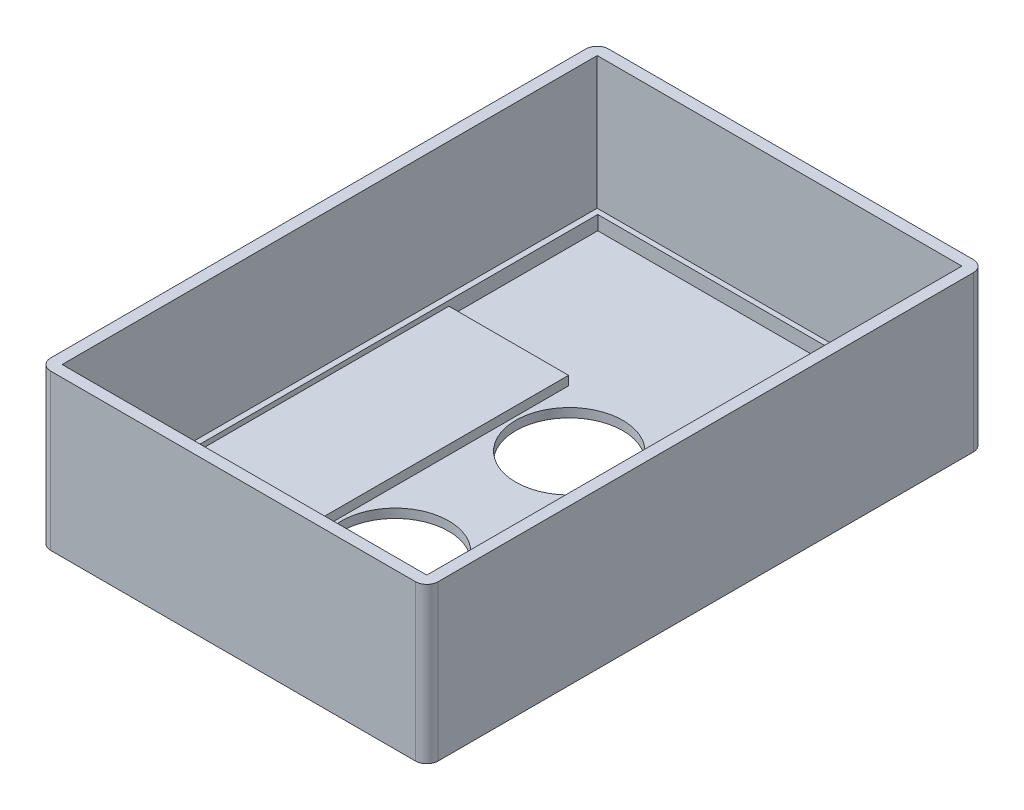
ISO-10303-21;
HEADER;
FILE_DESCRIPTION(('STEP AP214'),'2;1');
FILE_NAME('part.step','',(''),(''),'','','');
FILE_SCHEMA(('AUTOMOTIVE_DESIGN { 1 0 10303 214 1 1 1 1 }'));
ENDSEC;
DATA;
#1=APPLICATION_CONTEXT('core data for automotive mechanical design processes');
#2=APPLICATION_PROTOCOL_DEFINITION('international standard','automotive_design',2000,#1);
#3=PRODUCT_CONTEXT('',#1,'mechanical');
#4=PRODUCT('Part','Part','',(#3));
#5=PRODUCT_RELATED_PRODUCT_CATEGORY('part','',(#4));
#6=PRODUCT_DEFINITION_FORMATION('','',#4);
#7=PRODUCT_DEFINITION_CONTEXT('part definition',#1,'design');
#8=PRODUCT_DEFINITION('design','',#6,#7);
#9=PRODUCT_DEFINITION_SHAPE('','',#8);
#10=(LENGTH_UNIT() NAMED_UNIT(*) SI_UNIT(.MILLI.,.METRE.));
#11=(NAMED_UNIT(*) PLANE_ANGLE_UNIT() SI_UNIT($,.RADIAN.));
#12=(NAMED_UNIT(*) SI_UNIT($,.STERADIAN.) SOLID_ANGLE_UNIT());
#13=UNCERTAINTY_MEASURE_WITH_UNIT(LENGTH_MEASURE(1.E-05),#10,'distance_accuracy_value','');
#14=(GEOMETRIC_REPRESENTATION_CONTEXT(3) GLOBAL_UNCERTAINTY_ASSIGNED_CONTEXT((#13)) GLOBAL_UNIT_ASSIGNED_CONTEXT((#10,
#11,#12)) REPRESENTATION_CONTEXT('',''));
#15=CARTESIAN_POINT('',(0.,0.,0.));
#16=DIRECTION('',(0.,0.,1.));
#17=DIRECTION('',(1.,0.,0.));
#18=AXIS2_PLACEMENT_3D('',#15,#16,#17);
#19=CARTESIAN_POINT('',(0.,4.0386,0.));
#20=DIRECTION('',(0.,-1.,0.));
#21=DIRECTION('',(0.,0.,-1.));
#22=AXIS2_PLACEMENT_3D('',#19,#20,#21);
#23=PLANE('',#22);
#24=DIRECTION('',(1.,0.,0.));
#25=VECTOR('',#24,1.);
#26=CARTESIAN_POINT('',(30.48,4.0386,-87.471955448315));
#27=LINE('',#26,#25);
#28=CARTESIAN_POINT('',(3.81,4.0386,-87.471955448315));
#29=VERTEX_POINT('',#28);
#30=CARTESIAN_POINT('',(30.48,4.0386,-87.471955448315));
#31=VERTEX_POINT('',#30);
#32=EDGE_CURVE('E237',#29,#31,#27,.T.);
#33=ORIENTED_EDGE('',*,*,#32,.F.);
#34=DIRECTION('',(0.,0.,1.));
#35=VECTOR('',#34,1.);
#36=CARTESIAN_POINT('',(3.80999999999999,4.0386,-120.65));
#37=LINE('',#36,#35);
#38=CARTESIAN_POINT('',(3.81000000000001,4.0386,-3.81));
#39=VERTEX_POINT('',#38);
#40=EDGE_CURVE('E192',#29,#39,#37,.T.);
#41=ORIENTED_EDGE('',*,*,#40,.T.);
#42=DIRECTION('',(1.,0.,0.));
#43=VECTOR('',#42,1.);
#44=CARTESIAN_POINT('',(82.55,4.0386,-3.81000000000001));
#45=LINE('',#44,#43);
#46=CARTESIAN_POINT('',(30.48,4.0386,-3.81));
#47=VERTEX_POINT('',#46);
#48=EDGE_CURVE('E321',#39,#47,#45,.T.);
#49=ORIENTED_EDGE('',*,*,#48,.T.);
#50=DIRECTION('',(0.,0.,1.));
#51=VECTOR('',#50,1.);
#52=CARTESIAN_POINT('',(30.48,4.0386,-87.471955448315));
#53=LINE('',#52,#51);
#54=EDGE_CURVE('E240',#31,#47,#53,.T.);
#55=ORIENTED_EDGE('',*,*,#54,.F.);
#56=EDGE_LOOP('',(#33,#41,#49,#55));
#57=FACE_BOUND('',#56,.T.);
#58=ADVANCED_FACE('F34',(#57),#23,.F.);
#59=DIRECTION('',(0.,0.,-1.));
#60=VECTOR('',#59,1.);
#61=CARTESIAN_POINT('',(55.88,4.0386,-87.471955448315));
#62=LINE('',#61,#60);
#63=CARTESIAN_POINT('',(55.88,4.0386,-3.81));
#64=VERTEX_POINT('',#63);
#65=CARTESIAN_POINT('',(55.88,4.0386,-87.471955448315));
#66=VERTEX_POINT('',#65);
#67=EDGE_CURVE('E213',#64,#66,#62,.T.);
#68=ORIENTED_EDGE('',*,*,#67,.F.);
#69=CARTESIAN_POINT('',(82.55,4.0386,-3.81000000000001));
#70=VERTEX_POINT('',#69);
#71=EDGE_CURVE('E319',#64,#70,#45,.T.);
#72=ORIENTED_EDGE('',*,*,#71,.T.);
#73=DIRECTION('',(0.,0.,-1.));
#74=VECTOR('',#73,1.);
#75=CARTESIAN_POINT('',(82.55,4.0386,-120.65));
#76=LINE('',#75,#74);
#77=CARTESIAN_POINT('',(82.55,4.0386,-87.471955448315));
#78=VERTEX_POINT('',#77);
#79=EDGE_CURVE('E333',#70,#78,#76,.T.);
#80=ORIENTED_EDGE('',*,*,#79,.T.);
#81=DIRECTION('',(1.,0.,0.));
#82=VECTOR('',#81,1.);
#83=CARTESIAN_POINT('',(55.88,4.0386,-87.471955448315));
#84=LINE('',#83,#82);
#85=EDGE_CURVE('E210',#66,#78,#84,.T.);
#86=ORIENTED_EDGE('',*,*,#85,.F.);
#87=EDGE_LOOP('',(#68,#72,#80,#86));
#88=FACE_BOUND('',#87,.T.);
#89=ADVANCED_FACE('F436',(#88),#23,.F.);
#90=CARTESIAN_POINT('',(86.36,34.6202,-124.333));
#91=DIRECTION('',(-1.,0.,0.));
#92=DIRECTION('',(0.,0.,1.));
#93=AXIS2_PLACEMENT_3D('',#90,#91,#92);
#94=PLANE('',#93);
#95=DIRECTION('',(0.,0.,-1.));
#96=VECTOR('',#95,1.);
#97=CARTESIAN_POINT('',(86.36,34.6202,-124.333));
#98=LINE('',#97,#96);
#99=CARTESIAN_POINT('',(86.36,34.6202,-2.54));
#100=VERTEX_POINT('',#99);
#101=CARTESIAN_POINT('',(86.36,34.6202,-121.793));
#102=VERTEX_POINT('',#101);
#103=EDGE_CURVE('E313',#100,#102,#98,.T.);
#104=ORIENTED_EDGE('',*,*,#103,.F.);
#105=DIRECTION('',(0.,-1.,0.));
#106=VECTOR('',#105,1.);
#107=CARTESIAN_POINT('',(86.36,34.6202,-2.54));
#108=LINE('',#107,#106);
#109=CARTESIAN_POINT('',(86.36,0.,-2.54));
#110=VERTEX_POINT('',#109);
#111=EDGE_CURVE('E258',#100,#110,#108,.T.);
#112=ORIENTED_EDGE('',*,*,#111,.T.);
#113=DIRECTION('',(0.,0.,-1.));
#114=VECTOR('',#113,1.);
#115=CARTESIAN_POINT('',(86.36,0.,-124.333));
#116=LINE('',#115,#114);
#117=CARTESIAN_POINT('',(86.36,0.,-121.793));
#118=VERTEX_POINT('',#117);
#119=EDGE_CURVE('E303',#110,#118,#116,.T.);
#120=ORIENTED_EDGE('',*,*,#119,.T.);
#121=DIRECTION('',(0.,-1.,0.));
#122=VECTOR('',#121,1.);
#123=CARTESIAN_POINT('',(86.36,34.6202,-121.793));
#124=LINE('',#123,#122);
#125=EDGE_CURVE('E256',#118,#102,#124,.F.);
#126=ORIENTED_EDGE('',*,*,#125,.T.);
#127=EDGE_LOOP('',(#104,#112,#120,#126));
#128=FACE_BOUND('',#127,.T.);
#129=ADVANCED_FACE('F421',(#128),#94,.F.);
#130=CARTESIAN_POINT('',(86.36,34.6202,-124.333));
#131=DIRECTION('',(0.,0.,1.));
#132=DIRECTION('',(1.,0.,0.));
#133=AXIS2_PLACEMENT_3D('',#130,#131,#132);
#134=PLANE('',#133);
#135=DIRECTION('',(-1.,0.,0.));
#136=VECTOR('',#135,1.);
#137=CARTESIAN_POINT('',(86.36,0.,-124.333));
#138=LINE('',#137,#136);
#139=CARTESIAN_POINT('',(83.82,0.,-124.333));
#140=VERTEX_POINT('',#139);
#141=CARTESIAN_POINT('',(2.54,0.,-124.333));
#142=VERTEX_POINT('',#141);
#143=EDGE_CURVE('E292',#140,#142,#138,.T.);
#144=ORIENTED_EDGE('',*,*,#143,.T.);
#145=DIRECTION('',(0.,-1.,0.));
#146=VECTOR('',#145,1.);
#147=CARTESIAN_POINT('',(2.54,34.6202,-124.333));
#148=LINE('',#147,#146);
#149=CARTESIAN_POINT('',(2.54,34.6202,-124.333));
#150=VERTEX_POINT('',#149);
#151=EDGE_CURVE('E11',#142,#150,#148,.F.);
#152=ORIENTED_EDGE('',*,*,#151,.T.);
#153=DIRECTION('',(-1.,0.,0.));
#154=VECTOR('',#153,1.);
#155=CARTESIAN_POINT('',(86.36,34.6202,-124.333));
#156=LINE('',#155,#154);
#157=CARTESIAN_POINT('',(83.82,34.6202,-124.333));
#158=VERTEX_POINT('',#157);
#159=EDGE_CURVE('E294',#158,#150,#156,.T.);
#160=ORIENTED_EDGE('',*,*,#159,.F.);
#161=DIRECTION('',(0.,-1.,0.));
#162=VECTOR('',#161,1.);
#163=CARTESIAN_POINT('',(83.82,34.6202,-124.333));
#164=LINE('',#163,#162);
#165=EDGE_CURVE('E42',#158,#140,#164,.T.);
#166=ORIENTED_EDGE('',*,*,#165,.T.);
#167=EDGE_LOOP('',(#144,#152,#160,#166));
#168=FACE_BOUND('',#167,.T.);
#169=ADVANCED_FACE('F291',(#168),#134,.F.);
#170=CARTESIAN_POINT('',(0.,34.6202,-124.333));
#171=DIRECTION('',(1.,0.,0.));
#172=DIRECTION('',(0.,0.,-1.));
#173=AXIS2_PLACEMENT_3D('',#170,#171,#172);
#174=PLANE('',#173);
#175=DIRECTION('',(0.,0.,1.));
#176=VECTOR('',#175,1.);
#177=CARTESIAN_POINT('',(0.,0.,-124.333));
#178=LINE('',#177,#176);
#179=CARTESIAN_POINT('',(0.,0.,-121.793));
#180=VERTEX_POINT('',#179);
#181=CARTESIAN_POINT('',(0.,0.,-2.54000000000001));
#182=VERTEX_POINT('',#181);
#183=EDGE_CURVE('E302',#180,#182,#178,.T.);
#184=ORIENTED_EDGE('',*,*,#183,.T.);
#185=DIRECTION('',(0.,-1.,0.));
#186=VECTOR('',#185,1.);
#187=CARTESIAN_POINT('',(0.,34.6202,-2.53999999999999));
#188=LINE('',#187,#186);
#189=CARTESIAN_POINT('',(0.,34.6202,-2.54000000000001));
#190=VERTEX_POINT('',#189);
#191=EDGE_CURVE('E49',#182,#190,#188,.F.);
#192=ORIENTED_EDGE('',*,*,#191,.T.);
#193=DIRECTION('',(0.,0.,1.));
#194=VECTOR('',#193,1.);
#195=CARTESIAN_POINT('',(0.,34.6202,-124.333));
#196=LINE('',#195,#194);
#197=CARTESIAN_POINT('',(0.,34.6202,-121.793));
#198=VERTEX_POINT('',#197);
#199=EDGE_CURVE('E407',#198,#190,#196,.T.);
#200=ORIENTED_EDGE('',*,*,#199,.F.);
#201=DIRECTION('',(0.,-1.,0.));
#202=VECTOR('',#201,1.);
#203=CARTESIAN_POINT('',(0.,34.6202,-121.793));
#204=LINE('',#203,#202);
#205=EDGE_CURVE('E282',#198,#180,#204,.T.);
#206=ORIENTED_EDGE('',*,*,#205,.T.);
#207=EDGE_LOOP('',(#184,#192,#200,#206));
#208=FACE_BOUND('',#207,.T.);
#209=ADVANCED_FACE('F427',(#208),#174,.F.);
#210=CARTESIAN_POINT('',(86.36,34.6202,0.));
#211=DIRECTION('',(0.,0.,-1.));
#212=DIRECTION('',(-1.,0.,0.));
#213=AXIS2_PLACEMENT_3D('',#210,#211,#212);
#214=PLANE('',#213);
#215=DIRECTION('',(1.,0.,0.));
#216=VECTOR('',#215,1.);
#217=CARTESIAN_POINT('',(86.36,0.,0.));
#218=LINE('',#217,#216);
#219=CARTESIAN_POINT('',(2.54,0.,0.));
#220=VERTEX_POINT('',#219);
#221=CARTESIAN_POINT('',(83.82,0.,0.));
#222=VERTEX_POINT('',#221);
#223=EDGE_CURVE('E305',#220,#222,#218,.T.);
#224=ORIENTED_EDGE('',*,*,#223,.T.);
#225=DIRECTION('',(0.,-1.,0.));
#226=VECTOR('',#225,1.);
#227=CARTESIAN_POINT('',(83.82,34.6202,0.));
#228=LINE('',#227,#226);
#229=CARTESIAN_POINT('',(83.82,34.6202,0.));
#230=VERTEX_POINT('',#229);
#231=EDGE_CURVE('E273',#222,#230,#228,.F.);
#232=ORIENTED_EDGE('',*,*,#231,.T.);
#233=DIRECTION('',(1.,0.,0.));
#234=VECTOR('',#233,1.);
#235=CARTESIAN_POINT('',(86.36,34.6202,0.));
#236=LINE('',#235,#234);
#237=CARTESIAN_POINT('',(2.54,34.6202,0.));
#238=VERTEX_POINT('',#237);
#239=EDGE_CURVE('E316',#238,#230,#236,.T.);
#240=ORIENTED_EDGE('',*,*,#239,.F.);
#241=DIRECTION('',(0.,-1.,0.));
#242=VECTOR('',#241,1.);
#243=CARTESIAN_POINT('',(2.54,34.6202,0.));
#244=LINE('',#243,#242);
#245=EDGE_CURVE('E270',#238,#220,#244,.T.);
#246=ORIENTED_EDGE('',*,*,#245,.T.);
#247=EDGE_LOOP('',(#224,#232,#240,#246));
#248=FACE_BOUND('',#247,.T.);
#249=ADVANCED_FACE('F424',(#248),#214,.F.);
#250=CARTESIAN_POINT('',(0.,34.6202,0.));
#251=DIRECTION('',(0.,-1.,0.));
#252=DIRECTION('',(0.,0.,-1.));
#253=AXIS2_PLACEMENT_3D('',#250,#251,#252);
#254=PLANE('',#253);
#255=DIRECTION('',(1.,0.,0.));
#256=VECTOR('',#255,1.);
#257=CARTESIAN_POINT('',(83.82,34.6202,-2.54));
#258=LINE('',#257,#256);
#259=CARTESIAN_POINT('',(2.54,34.6202,-2.53999999999999));
#260=VERTEX_POINT('',#259);
#261=CARTESIAN_POINT('',(83.82,34.6202,-2.54));
#262=VERTEX_POINT('',#261);
#263=EDGE_CURVE('E346',#260,#262,#258,.T.);
#264=ORIENTED_EDGE('',*,*,#263,.F.);
#265=DIRECTION('',(0.,0.,1.));
#266=VECTOR('',#265,1.);
#267=CARTESIAN_POINT('',(2.53999999999999,34.6202,-121.793));
#268=LINE('',#267,#266);
#269=CARTESIAN_POINT('',(2.53999999999999,34.6202,-121.793));
#270=VERTEX_POINT('',#269);
#271=EDGE_CURVE('E339',#270,#260,#268,.T.);
#272=ORIENTED_EDGE('',*,*,#271,.F.);
#273=DIRECTION('',(-1.,0.,0.));
#274=VECTOR('',#273,1.);
#275=CARTESIAN_POINT('',(83.82,34.6202,-121.793));
#276=LINE('',#275,#274);
#277=CARTESIAN_POINT('',(83.82,34.6202,-121.793));
#278=VERTEX_POINT('',#277);
#279=EDGE_CURVE('E358',#278,#270,#276,.T.);
#280=ORIENTED_EDGE('',*,*,#279,.F.);
#281=DIRECTION('',(0.,0.,-1.));
#282=VECTOR('',#281,1.);
#283=CARTESIAN_POINT('',(83.82,34.6202,-121.793));
#284=LINE('',#283,#282);
#285=EDGE_CURVE('E370',#262,#278,#284,.T.);
#286=ORIENTED_EDGE('',*,*,#285,.F.);
#287=EDGE_LOOP('',(#264,#272,#280,#286));
#288=FACE_BOUND('',#287,.T.);
#289=ORIENTED_EDGE('',*,*,#239,.T.);
#290=CARTESIAN_POINT('',(83.82,34.6202,-2.54));
#291=DIRECTION('',(0.,-1.,0.));
#292=DIRECTION('',(0.,0.,-1.));
#293=AXIS2_PLACEMENT_3D('',#290,#291,#292);
#294=CIRCLE('',#293,2.54);
#295=EDGE_CURVE('E280',#230,#100,#294,.F.);
#296=ORIENTED_EDGE('',*,*,#295,.T.);
#297=ORIENTED_EDGE('',*,*,#103,.T.);
#298=CARTESIAN_POINT('',(83.82,34.6202,-121.793));
#299=DIRECTION('',(0.,-1.,0.));
#300=DIRECTION('',(0.,0.,-1.));
#301=AXIS2_PLACEMENT_3D('',#298,#299,#300);
#302=CIRCLE('',#301,2.54);
#303=EDGE_CURVE('E275',#102,#158,#302,.F.);
#304=ORIENTED_EDGE('',*,*,#303,.T.);
#305=ORIENTED_EDGE('',*,*,#159,.T.);
#306=CARTESIAN_POINT('',(2.54,34.6202,-121.793));
#307=DIRECTION('',(0.,-1.,0.));
#308=DIRECTION('',(0.,0.,-1.));
#309=AXIS2_PLACEMENT_3D('',#306,#307,#308);
#310=CIRCLE('',#309,2.54);
#311=EDGE_CURVE('E56',#150,#198,#310,.F.);
#312=ORIENTED_EDGE('',*,*,#311,.T.);
#313=ORIENTED_EDGE('',*,*,#199,.T.);
#314=CARTESIAN_POINT('',(2.54,34.6202,-2.53999999999999));
#315=DIRECTION('',(0.,-1.,0.));
#316=DIRECTION('',(0.,0.,-1.));
#317=AXIS2_PLACEMENT_3D('',#314,#315,#316);
#318=CIRCLE('',#317,2.54);
#319=EDGE_CURVE('E278',#190,#238,#318,.F.);
#320=ORIENTED_EDGE('',*,*,#319,.T.);
#321=EDGE_LOOP('',(#289,#296,#297,#304,#305,#312,#313,#320));
#322=FACE_BOUND('',#321,.T.);
#323=ADVANCED_FACE('F411',(#288,#322),#254,.F.);
#324=CARTESIAN_POINT('',(0.,0.,0.));
#325=DIRECTION('',(0.,-1.,0.));
#326=DIRECTION('',(0.,0.,-1.));
#327=AXIS2_PLACEMENT_3D('',#324,#325,#326);
#328=PLANE('',#327);
#329=CARTESIAN_POINT('',(43.18,0.,-74.93));
#330=DIRECTION('',(0.,-1.,0.));
#331=DIRECTION('',(0.,0.,-1.));
#332=AXIS2_PLACEMENT_3D('',#329,#330,#331);
#333=CIRCLE('',#332,11.938);
#334=CARTESIAN_POINT('',(43.18,0.,-86.868));
#335=VERTEX_POINT('',#334);
#336=EDGE_CURVE('E712',#335,#335,#333,.T.);
#337=ORIENTED_EDGE('',*,*,#336,.F.);
#338=EDGE_LOOP('',(#337));
#339=FACE_BOUND('',#338,.T.);
#340=CARTESIAN_POINT('',(43.18,0.,-36.1188));
#341=DIRECTION('',(0.,-1.,0.));
#342=DIRECTION('',(0.,0.,-1.));
#343=AXIS2_PLACEMENT_3D('',#340,#341,#342);
#344=CIRCLE('',#343,11.938);
#345=CARTESIAN_POINT('',(43.18,0.,-48.0568));
#346=VERTEX_POINT('',#345);
#347=EDGE_CURVE('E216',#346,#346,#344,.T.);
#348=ORIENTED_EDGE('',*,*,#347,.F.);
#349=EDGE_LOOP('',(#348));
#350=FACE_BOUND('',#349,.T.);
#351=ORIENTED_EDGE('',*,*,#119,.F.);
#352=CARTESIAN_POINT('',(83.82,0.,-2.54));
#353=DIRECTION('',(0.,-1.,0.));
#354=DIRECTION('',(0.,0.,-1.));
#355=AXIS2_PLACEMENT_3D('',#352,#353,#354);
#356=CIRCLE('',#355,2.54);
#357=EDGE_CURVE('E268',#110,#222,#356,.T.);
#358=ORIENTED_EDGE('',*,*,#357,.T.);
#359=ORIENTED_EDGE('',*,*,#223,.F.);
#360=CARTESIAN_POINT('',(2.54,0.,-2.53999999999999));
#361=DIRECTION('',(0.,-1.,0.));
#362=DIRECTION('',(0.,0.,-1.));
#363=AXIS2_PLACEMENT_3D('',#360,#361,#362);
#364=CIRCLE('',#363,2.54);
#365=EDGE_CURVE('E266',#220,#182,#364,.T.);
#366=ORIENTED_EDGE('',*,*,#365,.T.);
#367=ORIENTED_EDGE('',*,*,#183,.F.);
#368=CARTESIAN_POINT('',(2.54,0.,-121.793));
#369=DIRECTION('',(0.,-1.,0.));
#370=DIRECTION('',(0.,0.,-1.));
#371=AXIS2_PLACEMENT_3D('',#368,#369,#370);
#372=CIRCLE('',#371,2.54);
#373=EDGE_CURVE('E264',#180,#142,#372,.T.);
#374=ORIENTED_EDGE('',*,*,#373,.T.);
#375=ORIENTED_EDGE('',*,*,#143,.F.);
#376=CARTESIAN_POINT('',(83.82,0.,-121.793));
#377=DIRECTION('',(0.,-1.,0.));
#378=DIRECTION('',(0.,0.,-1.));
#379=AXIS2_PLACEMENT_3D('',#376,#377,#378);
#380=CIRCLE('',#379,2.54);
#381=EDGE_CURVE('E262',#140,#118,#380,.T.);
#382=ORIENTED_EDGE('',*,*,#381,.T.);
#383=EDGE_LOOP('',(#351,#358,#359,#366,#367,#374,#375,#382));
#384=FACE_BOUND('',#383,.T.);
#385=ADVANCED_FACE('F299',(#339,#350,#384),#328,.T.);
#386=CARTESIAN_POINT('',(0.,5.1562,0.));
#387=DIRECTION('',(0.,-1.,0.));
#388=DIRECTION('',(0.,0.,-1.));
#389=AXIS2_PLACEMENT_3D('',#386,#387,#388);
#390=PLANE('',#389);
#391=DIRECTION('',(0.,0.,1.));
#392=VECTOR('',#391,1.);
#393=CARTESIAN_POINT('',(2.53999999999999,5.1562,-121.793));
#394=LINE('',#393,#392);
#395=CARTESIAN_POINT('',(2.53999999999999,5.1562,-121.793));
#396=VERTEX_POINT('',#395);
#397=CARTESIAN_POINT('',(2.54,5.1562,-2.53999999999999));
#398=VERTEX_POINT('',#397);
#399=EDGE_CURVE('E354',#396,#398,#394,.T.);
#400=ORIENTED_EDGE('',*,*,#399,.T.);
#401=DIRECTION('',(1.,0.,0.));
#402=VECTOR('',#401,1.);
#403=CARTESIAN_POINT('',(83.82,5.1562,-2.54));
#404=LINE('',#403,#402);
#405=CARTESIAN_POINT('',(83.82,5.1562,-2.54));
#406=VERTEX_POINT('',#405);
#407=EDGE_CURVE('E357',#398,#406,#404,.T.);
#408=ORIENTED_EDGE('',*,*,#407,.T.);
#409=DIRECTION('',(0.,0.,-1.));
#410=VECTOR('',#409,1.);
#411=CARTESIAN_POINT('',(83.82,5.1562,-121.793));
#412=LINE('',#411,#410);
#413=CARTESIAN_POINT('',(83.82,5.1562,-121.793));
#414=VERTEX_POINT('',#413);
#415=EDGE_CURVE('E361',#406,#414,#412,.T.);
#416=ORIENTED_EDGE('',*,*,#415,.T.);
#417=DIRECTION('',(-1.,0.,0.));
#418=VECTOR('',#417,1.);
#419=CARTESIAN_POINT('',(83.82,5.1562,-121.793));
#420=LINE('',#419,#418);
#421=EDGE_CURVE('E364',#414,#396,#420,.T.);
#422=ORIENTED_EDGE('',*,*,#421,.T.);
#423=EDGE_LOOP('',(#400,#408,#416,#422));
#424=FACE_BOUND('',#423,.T.);
#425=DIRECTION('',(-1.,0.,0.));
#426=VECTOR('',#425,1.);
#427=CARTESIAN_POINT('',(82.55,5.1562,-120.65));
#428=LINE('',#427,#426);
#429=CARTESIAN_POINT('',(82.55,5.1562,-120.65));
#430=VERTEX_POINT('',#429);
#431=CARTESIAN_POINT('',(3.80999999999999,5.1562,-120.65));
#432=VERTEX_POINT('',#431);
#433=EDGE_CURVE('E385',#430,#432,#428,.T.);
#434=ORIENTED_EDGE('',*,*,#433,.F.);
#435=DIRECTION('',(0.,0.,-1.));
#436=VECTOR('',#435,1.);
#437=CARTESIAN_POINT('',(82.55,5.1562,-120.65));
#438=LINE('',#437,#436);
#439=CARTESIAN_POINT('',(82.55,5.1562,-3.81000000000001));
#440=VERTEX_POINT('',#439);
#441=EDGE_CURVE('E377',#440,#430,#438,.T.);
#442=ORIENTED_EDGE('',*,*,#441,.F.);
#443=DIRECTION('',(1.,0.,0.));
#444=VECTOR('',#443,1.);
#445=CARTESIAN_POINT('',(82.55,5.1562,-3.81000000000001));
#446=LINE('',#445,#444);
#447=CARTESIAN_POINT('',(3.81000000000001,5.1562,-3.81));
#448=VERTEX_POINT('',#447);
#449=EDGE_CURVE('E259',#448,#440,#446,.T.);
#450=ORIENTED_EDGE('',*,*,#449,.F.);
#451=DIRECTION('',(0.,0.,1.));
#452=VECTOR('',#451,1.);
#453=CARTESIAN_POINT('',(3.80999999999999,5.1562,-120.65));
#454=LINE('',#453,#452);
#455=EDGE_CURVE('E320',#432,#448,#454,.T.);
#456=ORIENTED_EDGE('',*,*,#455,.F.);
#457=EDGE_LOOP('',(#434,#442,#450,#456));
#458=FACE_BOUND('',#457,.T.);
#459=ADVANCED_FACE('F464',(#424,#458),#390,.F.);
#460=CARTESIAN_POINT('',(2.53999999999999,5.1562,-121.793));
#461=DIRECTION('',(-1.,0.,0.));
#462=DIRECTION('',(0.,0.,1.));
#463=AXIS2_PLACEMENT_3D('',#460,#461,#462);
#464=PLANE('',#463);
#465=ORIENTED_EDGE('',*,*,#271,.T.);
#466=DIRECTION('',(0.,1.,0.));
#467=VECTOR('',#466,1.);
#468=CARTESIAN_POINT('',(2.54,5.1562,-2.53999999999999));
#469=LINE('',#468,#467);
#470=EDGE_CURVE('E366',#398,#260,#469,.T.);
#471=ORIENTED_EDGE('',*,*,#470,.F.);
#472=ORIENTED_EDGE('',*,*,#399,.F.);
#473=DIRECTION('',(0.,1.,0.));
#474=VECTOR('',#473,1.);
#475=CARTESIAN_POINT('',(2.53999999999999,5.1562,-121.793));
#476=LINE('',#475,#474);
#477=EDGE_CURVE('E375',#396,#270,#476,.T.);
#478=ORIENTED_EDGE('',*,*,#477,.T.);
#479=EDGE_LOOP('',(#465,#471,#472,#478));
#480=FACE_BOUND('',#479,.T.);
#481=ADVANCED_FACE('F445',(#480),#464,.F.);
#482=CARTESIAN_POINT('',(83.82,5.1562,-121.793));
#483=DIRECTION('',(0.,0.,-1.));
#484=DIRECTION('',(-1.,0.,0.));
#485=AXIS2_PLACEMENT_3D('',#482,#483,#484);
#486=PLANE('',#485);
#487=ORIENTED_EDGE('',*,*,#279,.T.);
#488=ORIENTED_EDGE('',*,*,#477,.F.);
#489=ORIENTED_EDGE('',*,*,#421,.F.);
#490=DIRECTION('',(0.,1.,0.));
#491=VECTOR('',#490,1.);
#492=CARTESIAN_POINT('',(83.82,5.1562,-121.793));
#493=LINE('',#492,#491);
#494=EDGE_CURVE('E378',#414,#278,#493,.T.);
#495=ORIENTED_EDGE('',*,*,#494,.T.);
#496=EDGE_LOOP('',(#487,#488,#489,#495));
#497=FACE_BOUND('',#496,.T.);
#498=ADVANCED_FACE('F616',(#497),#486,.F.);
#499=CARTESIAN_POINT('',(83.82,5.1562,-121.793));
#500=DIRECTION('',(1.,0.,0.));
#501=DIRECTION('',(0.,0.,-1.));
#502=AXIS2_PLACEMENT_3D('',#499,#500,#501);
#503=PLANE('',#502);
#504=ORIENTED_EDGE('',*,*,#285,.T.);
#505=ORIENTED_EDGE('',*,*,#494,.F.);
#506=ORIENTED_EDGE('',*,*,#415,.F.);
#507=DIRECTION('',(0.,1.,0.));
#508=VECTOR('',#507,1.);
#509=CARTESIAN_POINT('',(83.82,5.1562,-2.54));
#510=LINE('',#509,#508);
#511=EDGE_CURVE('E380',#406,#262,#510,.T.);
#512=ORIENTED_EDGE('',*,*,#511,.T.);
#513=EDGE_LOOP('',(#504,#505,#506,#512));
#514=FACE_BOUND('',#513,.T.);
#515=ADVANCED_FACE('F608',(#514),#503,.F.);
#516=CARTESIAN_POINT('',(83.82,5.1562,-2.54));
#517=DIRECTION('',(0.,0.,1.));
#518=DIRECTION('',(1.,0.,0.));
#519=AXIS2_PLACEMENT_3D('',#516,#517,#518);
#520=PLANE('',#519);
#521=ORIENTED_EDGE('',*,*,#263,.T.);
#522=ORIENTED_EDGE('',*,*,#511,.F.);
#523=ORIENTED_EDGE('',*,*,#407,.F.);
#524=ORIENTED_EDGE('',*,*,#470,.T.);
#525=EDGE_LOOP('',(#521,#522,#523,#524));
#526=FACE_BOUND('',#525,.T.);
#527=ADVANCED_FACE('F455',(#526),#520,.F.);
#528=CARTESIAN_POINT('',(82.55,4.0386,-3.81000000000001));
#529=DIRECTION('',(0.,0.,1.));
#530=DIRECTION('',(1.,0.,0.));
#531=AXIS2_PLACEMENT_3D('',#528,#529,#530);
#532=PLANE('',#531);
#533=DIRECTION('',(0.,1.,0.));
#534=VECTOR('',#533,1.);
#535=CARTESIAN_POINT('',(3.81000000000001,4.0386,-3.81));
#536=LINE('',#535,#534);
#537=EDGE_CURVE('E336',#39,#448,#536,.T.);
#538=ORIENTED_EDGE('',*,*,#537,.T.);
#539=ORIENTED_EDGE('',*,*,#449,.T.);
#540=DIRECTION('',(0.,1.,0.));
#541=VECTOR('',#540,1.);
#542=CARTESIAN_POINT('',(82.55,4.0386,-3.81000000000001));
#543=LINE('',#542,#541);
#544=EDGE_CURVE('E398',#70,#440,#543,.T.);
#545=ORIENTED_EDGE('',*,*,#544,.F.);
#546=ORIENTED_EDGE('',*,*,#71,.F.);
#547=DIRECTION('',(0.,1.,0.));
#548=VECTOR('',#547,1.);
#549=CARTESIAN_POINT('',(55.88,2.0066,-3.81));
#550=LINE('',#549,#548);
#551=CARTESIAN_POINT('',(55.88,2.0066,-3.81));
#552=VERTEX_POINT('',#551);
#553=EDGE_CURVE('E244',#552,#64,#550,.T.);
#554=ORIENTED_EDGE('',*,*,#553,.F.);
#555=DIRECTION('',(1.,0.,0.));
#556=VECTOR('',#555,1.);
#557=CARTESIAN_POINT('',(30.48,2.0066,-3.81));
#558=LINE('',#557,#556);
#559=CARTESIAN_POINT('',(30.48,2.0066,-3.81));
#560=VERTEX_POINT('',#559);
#561=EDGE_CURVE('E220',#560,#552,#558,.T.);
#562=ORIENTED_EDGE('',*,*,#561,.F.);
#563=DIRECTION('',(0.,1.,0.));
#564=VECTOR('',#563,1.);
#565=CARTESIAN_POINT('',(30.48,2.0066,-3.81));
#566=LINE('',#565,#564);
#567=EDGE_CURVE('E242',#560,#47,#566,.T.);
#568=ORIENTED_EDGE('',*,*,#567,.T.);
#569=ORIENTED_EDGE('',*,*,#48,.F.);
#570=EDGE_LOOP('',(#538,#539,#545,#546,#554,#562,#568,#569));
#571=FACE_BOUND('',#570,.T.);
#572=ADVANCED_FACE('F394',(#571),#532,.F.);
#573=CARTESIAN_POINT('',(82.55,4.0386,-120.65));
#574=DIRECTION('',(1.,0.,0.));
#575=DIRECTION('',(0.,0.,-1.));
#576=AXIS2_PLACEMENT_3D('',#573,#574,#575);
#577=PLANE('',#576);
#578=ORIENTED_EDGE('',*,*,#544,.T.);
#579=ORIENTED_EDGE('',*,*,#441,.T.);
#580=DIRECTION('',(0.,1.,0.));
#581=VECTOR('',#580,1.);
#582=CARTESIAN_POINT('',(82.55,4.0386,-120.65));
#583=LINE('',#582,#581);
#584=CARTESIAN_POINT('',(82.55,2.0066,-120.65));
#585=VERTEX_POINT('',#584);
#586=EDGE_CURVE('E400',#585,#430,#583,.T.);
#587=ORIENTED_EDGE('',*,*,#586,.F.);
#588=DIRECTION('',(0.,0.,-1.));
#589=VECTOR('',#588,1.);
#590=CARTESIAN_POINT('',(82.55,2.0066,-120.65));
#591=LINE('',#590,#589);
#592=CARTESIAN_POINT('',(82.55,2.0066,-87.471955448315));
#593=VERTEX_POINT('',#592);
#594=EDGE_CURVE('E229',#593,#585,#591,.T.);
#595=ORIENTED_EDGE('',*,*,#594,.F.);
#596=DIRECTION('',(0.,1.,0.));
#597=VECTOR('',#596,1.);
#598=CARTESIAN_POINT('',(82.55,2.0066,-87.471955448315));
#599=LINE('',#598,#597);
#600=EDGE_CURVE('E337',#593,#78,#599,.T.);
#601=ORIENTED_EDGE('',*,*,#600,.T.);
#602=ORIENTED_EDGE('',*,*,#79,.F.);
#603=EDGE_LOOP('',(#578,#579,#587,#595,#601,#602));
#604=FACE_BOUND('',#603,.T.);
#605=ADVANCED_FACE('F450',(#604),#577,.F.);
#606=CARTESIAN_POINT('',(82.55,4.0386,-120.65));
#607=DIRECTION('',(0.,0.,-1.));
#608=DIRECTION('',(-1.,0.,0.));
#609=AXIS2_PLACEMENT_3D('',#606,#607,#608);
#610=PLANE('',#609);
#611=ORIENTED_EDGE('',*,*,#586,.T.);
#612=ORIENTED_EDGE('',*,*,#433,.T.);
#613=DIRECTION('',(0.,1.,0.));
#614=VECTOR('',#613,1.);
#615=CARTESIAN_POINT('',(3.80999999999999,4.0386,-120.65));
#616=LINE('',#615,#614);
#617=CARTESIAN_POINT('',(3.80999999999999,2.0066,-120.65));
#618=VERTEX_POINT('',#617);
#619=EDGE_CURVE('E307',#618,#432,#616,.T.);
#620=ORIENTED_EDGE('',*,*,#619,.F.);
#621=DIRECTION('',(-1.,0.,0.));
#622=VECTOR('',#621,1.);
#623=CARTESIAN_POINT('',(3.80999999999999,2.0066,-120.65));
#624=LINE('',#623,#622);
#625=EDGE_CURVE('E197',#585,#618,#624,.T.);
#626=ORIENTED_EDGE('',*,*,#625,.F.);
#627=EDGE_LOOP('',(#611,#612,#620,#626));
#628=FACE_BOUND('',#627,.T.);
#629=ADVANCED_FACE('F447',(#628),#610,.F.);
#630=CARTESIAN_POINT('',(3.80999999999999,4.0386,-120.65));
#631=DIRECTION('',(-1.,0.,0.));
#632=DIRECTION('',(0.,0.,1.));
#633=AXIS2_PLACEMENT_3D('',#630,#631,#632);
#634=PLANE('',#633);
#635=ORIENTED_EDGE('',*,*,#619,.T.);
#636=ORIENTED_EDGE('',*,*,#455,.T.);
#637=ORIENTED_EDGE('',*,*,#537,.F.);
#638=ORIENTED_EDGE('',*,*,#40,.F.);
#639=DIRECTION('',(0.,1.,0.));
#640=VECTOR('',#639,1.);
#641=CARTESIAN_POINT('',(3.81,2.0066,-87.471955448315));
#642=LINE('',#641,#640);
#643=CARTESIAN_POINT('',(3.81,2.0066,-87.471955448315));
#644=VERTEX_POINT('',#643);
#645=EDGE_CURVE('E184',#644,#29,#642,.T.);
#646=ORIENTED_EDGE('',*,*,#645,.F.);
#647=DIRECTION('',(0.,0.,1.));
#648=VECTOR('',#647,1.);
#649=CARTESIAN_POINT('',(3.80999999999999,2.0066,-120.65));
#650=LINE('',#649,#648);
#651=EDGE_CURVE('E189',#618,#644,#650,.T.);
#652=ORIENTED_EDGE('',*,*,#651,.F.);
#653=EDGE_LOOP('',(#635,#636,#637,#638,#646,#652));
#654=FACE_BOUND('',#653,.T.);
#655=ADVANCED_FACE('F187',(#654),#634,.F.);
#656=CARTESIAN_POINT('',(55.88,2.0066,-87.471955448315));
#657=DIRECTION('',(0.,0.,1.));
#658=DIRECTION('',(1.,0.,0.));
#659=AXIS2_PLACEMENT_3D('',#656,#657,#658);
#660=PLANE('',#659);
#661=ORIENTED_EDGE('',*,*,#85,.T.);
#662=ORIENTED_EDGE('',*,*,#600,.F.);
#663=DIRECTION('',(1.,0.,0.));
#664=VECTOR('',#663,1.);
#665=CARTESIAN_POINT('',(55.88,2.0066,-87.471955448315));
#666=LINE('',#665,#664);
#667=CARTESIAN_POINT('',(55.88,2.0066,-87.471955448315));
#668=VERTEX_POINT('',#667);
#669=EDGE_CURVE('E226',#668,#593,#666,.T.);
#670=ORIENTED_EDGE('',*,*,#669,.F.);
#671=DIRECTION('',(0.,1.,0.));
#672=VECTOR('',#671,1.);
#673=CARTESIAN_POINT('',(55.88,2.0066,-87.471955448315));
#674=LINE('',#673,#672);
#675=EDGE_CURVE('E252',#668,#66,#674,.T.);
#676=ORIENTED_EDGE('',*,*,#675,.T.);
#677=EDGE_LOOP('',(#661,#662,#670,#676));
#678=FACE_BOUND('',#677,.T.);
#679=ADVANCED_FACE('F458',(#678),#660,.F.);
#680=CARTESIAN_POINT('',(55.88,2.0066,-87.471955448315));
#681=DIRECTION('',(1.,0.,0.));
#682=DIRECTION('',(0.,0.,-1.));
#683=AXIS2_PLACEMENT_3D('',#680,#681,#682);
#684=PLANE('',#683);
#685=ORIENTED_EDGE('',*,*,#67,.T.);
#686=ORIENTED_EDGE('',*,*,#675,.F.);
#687=DIRECTION('',(0.,0.,-1.));
#688=VECTOR('',#687,1.);
#689=CARTESIAN_POINT('',(55.88,2.0066,-87.471955448315));
#690=LINE('',#689,#688);
#691=EDGE_CURVE('E223',#552,#668,#690,.T.);
#692=ORIENTED_EDGE('',*,*,#691,.F.);
#693=ORIENTED_EDGE('',*,*,#553,.T.);
#694=EDGE_LOOP('',(#685,#686,#692,#693));
#695=FACE_BOUND('',#694,.T.);
#696=ADVANCED_FACE('F541',(#695),#684,.F.);
#697=CARTESIAN_POINT('',(30.48,2.0066,-87.471955448315));
#698=DIRECTION('',(-1.,0.,0.));
#699=DIRECTION('',(0.,0.,1.));
#700=AXIS2_PLACEMENT_3D('',#697,#698,#699);
#701=PLANE('',#700);
#702=ORIENTED_EDGE('',*,*,#54,.T.);
#703=ORIENTED_EDGE('',*,*,#567,.F.);
#704=DIRECTION('',(0.,0.,1.));
#705=VECTOR('',#704,1.);
#706=CARTESIAN_POINT('',(30.48,2.0066,-87.471955448315));
#707=LINE('',#706,#705);
#708=CARTESIAN_POINT('',(30.48,2.0066,-87.471955448315));
#709=VERTEX_POINT('',#708);
#710=EDGE_CURVE('E205',#709,#560,#707,.T.);
#711=ORIENTED_EDGE('',*,*,#710,.F.);
#712=DIRECTION('',(0.,1.,0.));
#713=VECTOR('',#712,1.);
#714=CARTESIAN_POINT('',(30.48,2.0066,-87.471955448315));
#715=LINE('',#714,#713);
#716=EDGE_CURVE('E196',#709,#31,#715,.T.);
#717=ORIENTED_EDGE('',*,*,#716,.T.);
#718=EDGE_LOOP('',(#702,#703,#711,#717));
#719=FACE_BOUND('',#718,.T.);
#720=ADVANCED_FACE('F533',(#719),#701,.F.);
#721=CARTESIAN_POINT('',(30.48,2.0066,-87.471955448315));
#722=DIRECTION('',(0.,0.,1.));
#723=DIRECTION('',(1.,0.,0.));
#724=AXIS2_PLACEMENT_3D('',#721,#722,#723);
#725=PLANE('',#724);
#726=ORIENTED_EDGE('',*,*,#32,.T.);
#727=ORIENTED_EDGE('',*,*,#716,.F.);
#728=DIRECTION('',(1.,0.,0.));
#729=VECTOR('',#728,1.);
#730=CARTESIAN_POINT('',(30.48,2.0066,-87.471955448315));
#731=LINE('',#730,#729);
#732=EDGE_CURVE('E200',#644,#709,#731,.T.);
#733=ORIENTED_EDGE('',*,*,#732,.F.);
#734=ORIENTED_EDGE('',*,*,#645,.T.);
#735=EDGE_LOOP('',(#726,#727,#733,#734));
#736=FACE_BOUND('',#735,.T.);
#737=ADVANCED_FACE('F201',(#736),#725,.F.);
#738=CARTESIAN_POINT('',(0.,2.0066,0.));
#739=DIRECTION('',(0.,-1.,0.));
#740=DIRECTION('',(0.,0.,-1.));
#741=AXIS2_PLACEMENT_3D('',#738,#739,#740);
#742=PLANE('',#741);
#743=CARTESIAN_POINT('',(43.18,2.0066,-74.93));
#744=DIRECTION('',(0.,1.,0.));
#745=DIRECTION('',(0.,0.,1.));
#746=AXIS2_PLACEMENT_3D('',#743,#744,#745);
#747=CIRCLE('',#746,11.938);
#748=CARTESIAN_POINT('',(43.18,2.0066,-62.992));
#749=VERTEX_POINT('',#748);
#750=EDGE_CURVE('E707',#749,#749,#747,.T.);
#751=ORIENTED_EDGE('',*,*,#750,.F.);
#752=EDGE_LOOP('',(#751));
#753=FACE_BOUND('',#752,.T.);
#754=CARTESIAN_POINT('',(43.18,2.0066,-36.1188));
#755=DIRECTION('',(0.,1.,0.));
#756=DIRECTION('',(0.,0.,1.));
#757=AXIS2_PLACEMENT_3D('',#754,#755,#756);
#758=CIRCLE('',#757,11.938);
#759=CARTESIAN_POINT('',(43.18,2.0066,-24.1808));
#760=VERTEX_POINT('',#759);
#761=EDGE_CURVE('E710',#760,#760,#758,.T.);
#762=ORIENTED_EDGE('',*,*,#761,.F.);
#763=EDGE_LOOP('',(#762));
#764=FACE_BOUND('',#763,.T.);
#765=ORIENTED_EDGE('',*,*,#651,.T.);
#766=ORIENTED_EDGE('',*,*,#732,.T.);
#767=ORIENTED_EDGE('',*,*,#710,.T.);
#768=ORIENTED_EDGE('',*,*,#561,.T.);
#769=ORIENTED_EDGE('',*,*,#691,.T.);
#770=ORIENTED_EDGE('',*,*,#669,.T.);
#771=ORIENTED_EDGE('',*,*,#594,.T.);
#772=ORIENTED_EDGE('',*,*,#625,.T.);
#773=EDGE_LOOP('',(#765,#766,#767,#768,#769,#770,#771,#772));
#774=FACE_BOUND('',#773,.T.);
#775=ADVANCED_FACE('F207',(#753,#764,#774),#742,.F.);
#776=CARTESIAN_POINT('',(43.18,-0.0254000000000001,-36.1188));
#777=DIRECTION('',(0.,1.,0.));
#778=DIRECTION('',(0.,0.,1.));
#779=AXIS2_PLACEMENT_3D('',#776,#777,#778);
#780=CYLINDRICAL_SURFACE('',#779,11.938);
#781=ORIENTED_EDGE('',*,*,#347,.T.);
#782=EDGE_LOOP('',(#781));
#783=FACE_BOUND('',#782,.T.);
#784=ORIENTED_EDGE('',*,*,#761,.T.);
#785=EDGE_LOOP('',(#784));
#786=FACE_BOUND('',#785,.T.);
#787=ADVANCED_FACE('F507',(#783,#786),#780,.F.);
#788=CARTESIAN_POINT('',(43.18,-0.0254000000000001,-74.93));
#789=DIRECTION('',(0.,1.,0.));
#790=DIRECTION('',(0.,0.,1.));
#791=AXIS2_PLACEMENT_3D('',#788,#789,#790);
#792=CYLINDRICAL_SURFACE('',#791,11.938);
#793=ORIENTED_EDGE('',*,*,#336,.T.);
#794=EDGE_LOOP('',(#793));
#795=FACE_BOUND('',#794,.T.);
#796=ORIENTED_EDGE('',*,*,#750,.T.);
#797=EDGE_LOOP('',(#796));
#798=FACE_BOUND('',#797,.T.);
#799=ADVANCED_FACE('F476',(#795,#798),#792,.F.);
#800=CARTESIAN_POINT('',(83.82,34.6202,-2.54));
#801=DIRECTION('',(0.,-1.,0.));
#802=DIRECTION('',(0.,0.,-1.));
#803=AXIS2_PLACEMENT_3D('',#800,#801,#802);
#804=CYLINDRICAL_SURFACE('',#803,2.54);
#805=ORIENTED_EDGE('',*,*,#295,.F.);
#806=ORIENTED_EDGE('',*,*,#231,.F.);
#807=ORIENTED_EDGE('',*,*,#357,.F.);
#808=ORIENTED_EDGE('',*,*,#111,.F.);
#809=EDGE_LOOP('',(#805,#806,#807,#808));
#810=FACE_BOUND('',#809,.T.);
#811=ADVANCED_FACE('F419',(#810),#804,.T.);
#812=CARTESIAN_POINT('',(2.54,34.6202,-2.53999999999999));
#813=DIRECTION('',(0.,-1.,0.));
#814=DIRECTION('',(0.,0.,-1.));
#815=AXIS2_PLACEMENT_3D('',#812,#813,#814);
#816=CYLINDRICAL_SURFACE('',#815,2.54);
#817=ORIENTED_EDGE('',*,*,#319,.F.);
#818=ORIENTED_EDGE('',*,*,#191,.F.);
#819=ORIENTED_EDGE('',*,*,#365,.F.);
#820=ORIENTED_EDGE('',*,*,#245,.F.);
#821=EDGE_LOOP('',(#817,#818,#819,#820));
#822=FACE_BOUND('',#821,.T.);
#823=ADVANCED_FACE('F426',(#822),#816,.T.);
#824=CARTESIAN_POINT('',(2.54,34.6202,-121.793));
#825=DIRECTION('',(0.,-1.,0.));
#826=DIRECTION('',(0.,0.,-1.));
#827=AXIS2_PLACEMENT_3D('',#824,#825,#826);
#828=CYLINDRICAL_SURFACE('',#827,2.54);
#829=ORIENTED_EDGE('',*,*,#311,.F.);
#830=ORIENTED_EDGE('',*,*,#151,.F.);
#831=ORIENTED_EDGE('',*,*,#373,.F.);
#832=ORIENTED_EDGE('',*,*,#205,.F.);
#833=EDGE_LOOP('',(#829,#830,#831,#832));
#834=FACE_BOUND('',#833,.T.);
#835=ADVANCED_FACE('F430',(#834),#828,.T.);
#836=CARTESIAN_POINT('',(83.82,34.6202,-121.793));
#837=DIRECTION('',(0.,-1.,0.));
#838=DIRECTION('',(0.,0.,-1.));
#839=AXIS2_PLACEMENT_3D('',#836,#837,#838);
#840=CYLINDRICAL_SURFACE('',#839,2.54);
#841=ORIENTED_EDGE('',*,*,#303,.F.);
#842=ORIENTED_EDGE('',*,*,#125,.F.);
#843=ORIENTED_EDGE('',*,*,#381,.F.);
#844=ORIENTED_EDGE('',*,*,#165,.F.);
#845=EDGE_LOOP('',(#841,#842,#843,#844));
#846=FACE_BOUND('',#845,.T.);
#847=ADVANCED_FACE('F36',(#846),#840,.T.);
#848=CLOSED_SHELL('',(#58,#89,#129,#169,#209,#249,#323,#385,#459,#481,#498,#515,#527,#572,#605,
#629,#655,#679,#696,#720,#737,#775,#787,#799,#811,#823,#835,#847));
#849=MANIFOLD_SOLID_BREP('B2',#848);
#850=ADVANCED_BREP_SHAPE_REPRESENTATION('',(#18,#849),#14);
#851=SHAPE_DEFINITION_REPRESENTATION(#9,#850);
ENDSEC;
END-ISO-10303-21;
